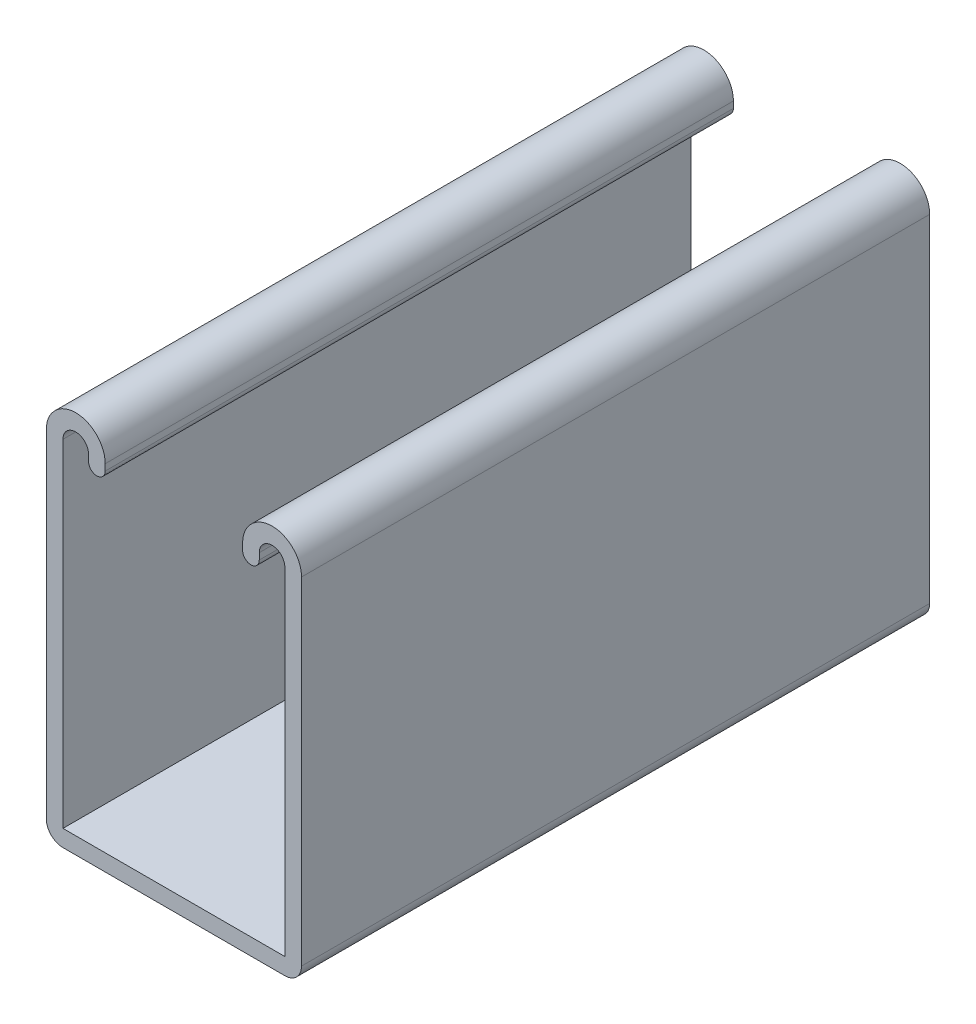
ISO-10303-21;
HEADER;
FILE_DESCRIPTION(('STEP AP214'),'2;1');
FILE_NAME('part.step','',(''),(''),'','','');
FILE_SCHEMA(('AUTOMOTIVE_DESIGN { 1 0 10303 214 1 1 1 1 }'));
ENDSEC;
DATA;
#1=APPLICATION_CONTEXT('core data for automotive mechanical design processes');
#2=APPLICATION_PROTOCOL_DEFINITION('international standard','automotive_design',2000,#1);
#3=PRODUCT_CONTEXT('',#1,'mechanical');
#4=PRODUCT('Part','Part','',(#3));
#5=PRODUCT_RELATED_PRODUCT_CATEGORY('part','',(#4));
#6=PRODUCT_DEFINITION_FORMATION('','',#4);
#7=PRODUCT_DEFINITION_CONTEXT('part definition',#1,'design');
#8=PRODUCT_DEFINITION('design','',#6,#7);
#9=PRODUCT_DEFINITION_SHAPE('','',#8);
#10=(LENGTH_UNIT() NAMED_UNIT(*) SI_UNIT(.MILLI.,.METRE.));
#11=(NAMED_UNIT(*) PLANE_ANGLE_UNIT() SI_UNIT($,.RADIAN.));
#12=(NAMED_UNIT(*) SI_UNIT($,.STERADIAN.) SOLID_ANGLE_UNIT());
#13=UNCERTAINTY_MEASURE_WITH_UNIT(LENGTH_MEASURE(1.E-05),#10,'distance_accuracy_value','');
#14=(GEOMETRIC_REPRESENTATION_CONTEXT(3) GLOBAL_UNCERTAINTY_ASSIGNED_CONTEXT((#13)) GLOBAL_UNIT_ASSIGNED_CONTEXT((#10,
#11,#12)) REPRESENTATION_CONTEXT('',''));
#15=CARTESIAN_POINT('',(0.,0.,0.));
#16=DIRECTION('',(0.,0.,1.));
#17=DIRECTION('',(1.,0.,0.));
#18=AXIS2_PLACEMENT_3D('',#15,#16,#17);
#19=CARTESIAN_POINT('',(-15.875,29.1719,101.6));
#20=DIRECTION('',(0.,0.,-1.));
#21=DIRECTION('',(-1.,0.,0.));
#22=AXIS2_PLACEMENT_3D('',#19,#20,#21);
#23=CYLINDRICAL_SURFACE('',#22,4.7625);
#24=CARTESIAN_POINT('',(-15.875,29.1719,0.));
#25=DIRECTION('',(0.,0.,1.));
#26=DIRECTION('',(-1.,0.,0.));
#27=AXIS2_PLACEMENT_3D('',#24,#25,#26);
#28=CIRCLE('',#27,4.7625);
#29=CARTESIAN_POINT('',(-11.1125,29.1719,0.));
#30=VERTEX_POINT('',#29);
#31=CARTESIAN_POINT('',(-20.6375,29.1719,0.));
#32=VERTEX_POINT('',#31);
#33=EDGE_CURVE('E189',#30,#32,#28,.T.);
#34=ORIENTED_EDGE('',*,*,#33,.T.);
#35=DIRECTION('',(0.,0.,-1.));
#36=VECTOR('',#35,1.);
#37=CARTESIAN_POINT('',(-20.6375,29.1719,101.6));
#38=LINE('',#37,#36);
#39=CARTESIAN_POINT('',(-20.6375,29.1719,101.6));
#40=VERTEX_POINT('',#39);
#41=EDGE_CURVE('E11',#40,#32,#38,.T.);
#42=ORIENTED_EDGE('',*,*,#41,.F.);
#43=CARTESIAN_POINT('',(-15.875,29.1719,101.6));
#44=DIRECTION('',(0.,0.,1.));
#45=DIRECTION('',(-1.,0.,0.));
#46=AXIS2_PLACEMENT_3D('',#43,#44,#45);
#47=CIRCLE('',#46,4.7625);
#48=CARTESIAN_POINT('',(-11.1125,29.1719,101.6));
#49=VERTEX_POINT('',#48);
#50=EDGE_CURVE('E223',#49,#40,#47,.T.);
#51=ORIENTED_EDGE('',*,*,#50,.F.);
#52=DIRECTION('',(0.,0.,-1.));
#53=VECTOR('',#52,1.);
#54=CARTESIAN_POINT('',(-11.1125,29.1719,101.6));
#55=LINE('',#54,#53);
#56=EDGE_CURVE('E185',#49,#30,#55,.T.);
#57=ORIENTED_EDGE('',*,*,#56,.T.);
#58=EDGE_LOOP('',(#34,#42,#51,#57));
#59=FACE_BOUND('',#58,.T.);
#60=ADVANCED_FACE('F32',(#59),#23,.T.);
#61=CARTESIAN_POINT('',(-20.6375,29.1719,101.6));
#62=DIRECTION('',(1.,0.,0.));
#63=DIRECTION('',(0.,1.,0.));
#64=AXIS2_PLACEMENT_3D('',#61,#62,#63);
#65=PLANE('',#64);
#66=DIRECTION('',(0.,-1.,0.));
#67=VECTOR('',#66,1.);
#68=CARTESIAN_POINT('',(-20.6375,29.1719,0.));
#69=LINE('',#68,#67);
#70=CARTESIAN_POINT('',(-20.6375,-25.3238,0.));
#71=VERTEX_POINT('',#70);
#72=EDGE_CURVE('E192',#32,#71,#69,.T.);
#73=ORIENTED_EDGE('',*,*,#72,.T.);
#74=DIRECTION('',(0.,0.,-1.));
#75=VECTOR('',#74,1.);
#76=CARTESIAN_POINT('',(-20.6375,-25.3238,101.6));
#77=LINE('',#76,#75);
#78=CARTESIAN_POINT('',(-20.6375,-25.3238,101.6));
#79=VERTEX_POINT('',#78);
#80=EDGE_CURVE('E41',#79,#71,#77,.T.);
#81=ORIENTED_EDGE('',*,*,#80,.F.);
#82=DIRECTION('',(0.,-1.,0.));
#83=VECTOR('',#82,1.);
#84=CARTESIAN_POINT('',(-20.6375,29.1719,101.6));
#85=LINE('',#84,#83);
#86=EDGE_CURVE('E122',#40,#79,#85,.T.);
#87=ORIENTED_EDGE('',*,*,#86,.F.);
#88=ORIENTED_EDGE('',*,*,#41,.T.);
#89=EDGE_LOOP('',(#73,#81,#87,#88));
#90=FACE_BOUND('',#89,.T.);
#91=ADVANCED_FACE('F332',(#90),#65,.F.);
#92=CARTESIAN_POINT('',(-17.9451,-25.3238,101.6));
#93=DIRECTION('',(0.,0.,-1.));
#94=DIRECTION('',(-1.,0.,0.));
#95=AXIS2_PLACEMENT_3D('',#92,#93,#94);
#96=CYLINDRICAL_SURFACE('',#95,2.6924);
#97=CARTESIAN_POINT('',(-17.9451,-25.3238,0.));
#98=DIRECTION('',(0.,0.,1.));
#99=DIRECTION('',(-1.,0.,0.));
#100=AXIS2_PLACEMENT_3D('',#97,#98,#99);
#101=CIRCLE('',#100,2.6924);
#102=CARTESIAN_POINT('',(-17.9451,-28.0162,0.));
#103=VERTEX_POINT('',#102);
#104=EDGE_CURVE('E194',#71,#103,#101,.T.);
#105=ORIENTED_EDGE('',*,*,#104,.T.);
#106=DIRECTION('',(0.,0.,-1.));
#107=VECTOR('',#106,1.);
#108=CARTESIAN_POINT('',(-17.9451,-28.0162,101.6));
#109=LINE('',#108,#107);
#110=CARTESIAN_POINT('',(-17.9451,-28.0162,101.6));
#111=VERTEX_POINT('',#110);
#112=EDGE_CURVE('E260',#111,#103,#109,.T.);
#113=ORIENTED_EDGE('',*,*,#112,.F.);
#114=CARTESIAN_POINT('',(-17.9451,-25.3238,101.6));
#115=DIRECTION('',(0.,0.,1.));
#116=DIRECTION('',(-1.,0.,0.));
#117=AXIS2_PLACEMENT_3D('',#114,#115,#116);
#118=CIRCLE('',#117,2.6924);
#119=EDGE_CURVE('E269',#79,#111,#118,.T.);
#120=ORIENTED_EDGE('',*,*,#119,.F.);
#121=ORIENTED_EDGE('',*,*,#80,.T.);
#122=EDGE_LOOP('',(#105,#113,#120,#121));
#123=FACE_BOUND('',#122,.T.);
#124=ADVANCED_FACE('F267',(#123),#96,.T.);
#125=CARTESIAN_POINT('',(-17.9451,-28.0162,101.6));
#126=DIRECTION('',(0.,1.,0.));
#127=DIRECTION('',(-1.,0.,0.));
#128=AXIS2_PLACEMENT_3D('',#125,#126,#127);
#129=PLANE('',#128);
#130=CARTESIAN_POINT('',(0.,-28.0162,71.4375));
#131=DIRECTION('',(0.,-1.,0.));
#132=DIRECTION('',(1.,0.,0.));
#133=AXIS2_PLACEMENT_3D('',#130,#131,#132);
#134=CIRCLE('',#133,7.14375);
#135=CARTESIAN_POINT('',(7.14375,-28.0162,71.4375));
#136=VERTEX_POINT('',#135);
#137=EDGE_CURVE('E451',#136,#136,#134,.T.);
#138=ORIENTED_EDGE('',*,*,#137,.F.);
#139=EDGE_LOOP('',(#138));
#140=FACE_BOUND('',#139,.T.);
#141=CARTESIAN_POINT('',(0.,-28.0162,23.8125));
#142=DIRECTION('',(0.,-1.,0.));
#143=DIRECTION('',(1.,0.,0.));
#144=AXIS2_PLACEMENT_3D('',#141,#142,#143);
#145=CIRCLE('',#144,7.14375);
#146=CARTESIAN_POINT('',(7.14375,-28.0162,23.8125));
#147=VERTEX_POINT('',#146);
#148=EDGE_CURVE('E455',#147,#147,#145,.T.);
#149=ORIENTED_EDGE('',*,*,#148,.F.);
#150=EDGE_LOOP('',(#149));
#151=FACE_BOUND('',#150,.T.);
#152=DIRECTION('',(1.,0.,0.));
#153=VECTOR('',#152,1.);
#154=CARTESIAN_POINT('',(-17.9451,-28.0162,0.));
#155=LINE('',#154,#153);
#156=CARTESIAN_POINT('',(17.9451,-28.0162,0.));
#157=VERTEX_POINT('',#156);
#158=EDGE_CURVE('E196',#103,#157,#155,.T.);
#159=ORIENTED_EDGE('',*,*,#158,.T.);
#160=DIRECTION('',(0.,0.,-1.));
#161=VECTOR('',#160,1.);
#162=CARTESIAN_POINT('',(17.9451,-28.0162,101.6));
#163=LINE('',#162,#161);
#164=CARTESIAN_POINT('',(17.9451,-28.0162,101.6));
#165=VERTEX_POINT('',#164);
#166=EDGE_CURVE('E257',#165,#157,#163,.T.);
#167=ORIENTED_EDGE('',*,*,#166,.F.);
#168=DIRECTION('',(1.,0.,0.));
#169=VECTOR('',#168,1.);
#170=CARTESIAN_POINT('',(-17.9451,-28.0162,101.6));
#171=LINE('',#170,#169);
#172=EDGE_CURVE('E287',#111,#165,#171,.T.);
#173=ORIENTED_EDGE('',*,*,#172,.F.);
#174=ORIENTED_EDGE('',*,*,#112,.T.);
#175=EDGE_LOOP('',(#159,#167,#173,#174));
#176=FACE_BOUND('',#175,.T.);
#177=ADVANCED_FACE('F278',(#140,#151,#176),#129,.F.);
#178=CARTESIAN_POINT('',(17.9451,-25.3238,101.6));
#179=DIRECTION('',(0.,0.,-1.));
#180=DIRECTION('',(-1.,0.,0.));
#181=AXIS2_PLACEMENT_3D('',#178,#179,#180);
#182=CYLINDRICAL_SURFACE('',#181,2.6924);
#183=CARTESIAN_POINT('',(17.9451,-25.3238,0.));
#184=DIRECTION('',(0.,0.,1.));
#185=DIRECTION('',(1.,0.,0.));
#186=AXIS2_PLACEMENT_3D('',#183,#184,#185);
#187=CIRCLE('',#186,2.6924);
#188=CARTESIAN_POINT('',(20.6375,-25.3238,0.));
#189=VERTEX_POINT('',#188);
#190=EDGE_CURVE('E198',#157,#189,#187,.T.);
#191=ORIENTED_EDGE('',*,*,#190,.T.);
#192=DIRECTION('',(0.,0.,-1.));
#193=VECTOR('',#192,1.);
#194=CARTESIAN_POINT('',(20.6375,-25.3238,101.6));
#195=LINE('',#194,#193);
#196=CARTESIAN_POINT('',(20.6375,-25.3238,101.6));
#197=VERTEX_POINT('',#196);
#198=EDGE_CURVE('E254',#197,#189,#195,.T.);
#199=ORIENTED_EDGE('',*,*,#198,.F.);
#200=CARTESIAN_POINT('',(17.9451,-25.3238,101.6));
#201=DIRECTION('',(0.,0.,1.));
#202=DIRECTION('',(1.,0.,0.));
#203=AXIS2_PLACEMENT_3D('',#200,#201,#202);
#204=CIRCLE('',#203,2.6924);
#205=EDGE_CURVE('E284',#165,#197,#204,.T.);
#206=ORIENTED_EDGE('',*,*,#205,.F.);
#207=ORIENTED_EDGE('',*,*,#166,.T.);
#208=EDGE_LOOP('',(#191,#199,#206,#207));
#209=FACE_BOUND('',#208,.T.);
#210=ADVANCED_FACE('F282',(#209),#182,.T.);
#211=CARTESIAN_POINT('',(20.6375,-25.3238,101.6));
#212=DIRECTION('',(-1.,0.,0.));
#213=DIRECTION('',(0.,-1.,0.));
#214=AXIS2_PLACEMENT_3D('',#211,#212,#213);
#215=PLANE('',#214);
#216=DIRECTION('',(0.,1.,0.));
#217=VECTOR('',#216,1.);
#218=CARTESIAN_POINT('',(20.6375,-25.3238,0.));
#219=LINE('',#218,#217);
#220=CARTESIAN_POINT('',(20.6375,29.1719,0.));
#221=VERTEX_POINT('',#220);
#222=EDGE_CURVE('E200',#189,#221,#219,.T.);
#223=ORIENTED_EDGE('',*,*,#222,.T.);
#224=DIRECTION('',(0.,0.,-1.));
#225=VECTOR('',#224,1.);
#226=CARTESIAN_POINT('',(20.6375,29.1719,101.6));
#227=LINE('',#226,#225);
#228=CARTESIAN_POINT('',(20.6375,29.1719,101.6));
#229=VERTEX_POINT('',#228);
#230=EDGE_CURVE('E251',#229,#221,#227,.T.);
#231=ORIENTED_EDGE('',*,*,#230,.F.);
#232=DIRECTION('',(0.,1.,0.));
#233=VECTOR('',#232,1.);
#234=CARTESIAN_POINT('',(20.6375,-25.3238,101.6));
#235=LINE('',#234,#233);
#236=EDGE_CURVE('E286',#197,#229,#235,.T.);
#237=ORIENTED_EDGE('',*,*,#236,.F.);
#238=ORIENTED_EDGE('',*,*,#198,.T.);
#239=EDGE_LOOP('',(#223,#231,#237,#238));
#240=FACE_BOUND('',#239,.T.);
#241=ADVANCED_FACE('F346',(#240),#215,.F.);
#242=CARTESIAN_POINT('',(15.875,29.1719,101.6));
#243=DIRECTION('',(0.,0.,-1.));
#244=DIRECTION('',(-1.,0.,0.));
#245=AXIS2_PLACEMENT_3D('',#242,#243,#244);
#246=CYLINDRICAL_SURFACE('',#245,4.7625);
#247=CARTESIAN_POINT('',(15.875,29.1719,0.));
#248=DIRECTION('',(0.,0.,1.));
#249=DIRECTION('',(1.,0.,0.));
#250=AXIS2_PLACEMENT_3D('',#247,#248,#249);
#251=CIRCLE('',#250,4.7625);
#252=CARTESIAN_POINT('',(11.1125,29.1719,0.));
#253=VERTEX_POINT('',#252);
#254=EDGE_CURVE('E202',#221,#253,#251,.T.);
#255=ORIENTED_EDGE('',*,*,#254,.T.);
#256=DIRECTION('',(0.,0.,-1.));
#257=VECTOR('',#256,1.);
#258=CARTESIAN_POINT('',(11.1125,29.1719,101.6));
#259=LINE('',#258,#257);
#260=CARTESIAN_POINT('',(11.1125,29.1719,101.6));
#261=VERTEX_POINT('',#260);
#262=EDGE_CURVE('E248',#261,#253,#259,.T.);
#263=ORIENTED_EDGE('',*,*,#262,.F.);
#264=CARTESIAN_POINT('',(15.875,29.1719,101.6));
#265=DIRECTION('',(0.,0.,1.));
#266=DIRECTION('',(1.,0.,0.));
#267=AXIS2_PLACEMENT_3D('',#264,#265,#266);
#268=CIRCLE('',#267,4.7625);
#269=EDGE_CURVE('E289',#229,#261,#268,.T.);
#270=ORIENTED_EDGE('',*,*,#269,.F.);
#271=ORIENTED_EDGE('',*,*,#230,.T.);
#272=EDGE_LOOP('',(#255,#263,#270,#271));
#273=FACE_BOUND('',#272,.T.);
#274=ADVANCED_FACE('F349',(#273),#246,.T.);
#275=CARTESIAN_POINT('',(11.1125,29.1719,101.6));
#276=DIRECTION('',(1.,0.,0.));
#277=DIRECTION('',(0.,1.,0.));
#278=AXIS2_PLACEMENT_3D('',#275,#276,#277);
#279=PLANE('',#278);
#280=DIRECTION('',(0.,-1.,0.));
#281=VECTOR('',#280,1.);
#282=CARTESIAN_POINT('',(11.1125,29.1719,0.));
#283=LINE('',#282,#281);
#284=CARTESIAN_POINT('',(11.1125,28.13685,0.));
#285=VERTEX_POINT('',#284);
#286=EDGE_CURVE('E204',#253,#285,#283,.T.);
#287=ORIENTED_EDGE('',*,*,#286,.T.);
#288=DIRECTION('',(0.,0.,-1.));
#289=VECTOR('',#288,1.);
#290=CARTESIAN_POINT('',(11.1125,28.13685,101.6));
#291=LINE('',#290,#289);
#292=CARTESIAN_POINT('',(11.1125,28.13685,101.6));
#293=VERTEX_POINT('',#292);
#294=EDGE_CURVE('E245',#293,#285,#291,.T.);
#295=ORIENTED_EDGE('',*,*,#294,.F.);
#296=DIRECTION('',(0.,-1.,0.));
#297=VECTOR('',#296,1.);
#298=CARTESIAN_POINT('',(11.1125,29.1719,101.6));
#299=LINE('',#298,#297);
#300=EDGE_CURVE('E295',#261,#293,#299,.T.);
#301=ORIENTED_EDGE('',*,*,#300,.F.);
#302=ORIENTED_EDGE('',*,*,#262,.T.);
#303=EDGE_LOOP('',(#287,#295,#301,#302));
#304=FACE_BOUND('',#303,.T.);
#305=ADVANCED_FACE('F353',(#304),#279,.F.);
#306=CARTESIAN_POINT('',(12.4587,28.13685,101.6));
#307=DIRECTION('',(0.,0.,-1.));
#308=DIRECTION('',(-1.,0.,0.));
#309=AXIS2_PLACEMENT_3D('',#306,#307,#308);
#310=CYLINDRICAL_SURFACE('',#309,1.3462);
#311=CARTESIAN_POINT('',(12.4587,28.13685,0.));
#312=DIRECTION('',(0.,0.,1.));
#313=DIRECTION('',(1.,0.,0.));
#314=AXIS2_PLACEMENT_3D('',#311,#312,#313);
#315=CIRCLE('',#314,1.3462);
#316=CARTESIAN_POINT('',(13.8049,28.13685,0.));
#317=VERTEX_POINT('',#316);
#318=EDGE_CURVE('E206',#285,#317,#315,.T.);
#319=ORIENTED_EDGE('',*,*,#318,.T.);
#320=DIRECTION('',(0.,0.,-1.));
#321=VECTOR('',#320,1.);
#322=CARTESIAN_POINT('',(13.8049,28.13685,101.6));
#323=LINE('',#322,#321);
#324=CARTESIAN_POINT('',(13.8049,28.13685,101.6));
#325=VERTEX_POINT('',#324);
#326=EDGE_CURVE('E242',#325,#317,#323,.T.);
#327=ORIENTED_EDGE('',*,*,#326,.F.);
#328=CARTESIAN_POINT('',(12.4587,28.13685,101.6));
#329=DIRECTION('',(0.,0.,1.));
#330=DIRECTION('',(1.,0.,0.));
#331=AXIS2_PLACEMENT_3D('',#328,#329,#330);
#332=CIRCLE('',#331,1.3462);
#333=EDGE_CURVE('E297',#293,#325,#332,.T.);
#334=ORIENTED_EDGE('',*,*,#333,.F.);
#335=ORIENTED_EDGE('',*,*,#294,.T.);
#336=EDGE_LOOP('',(#319,#327,#334,#335));
#337=FACE_BOUND('',#336,.T.);
#338=ADVANCED_FACE('F357',(#337),#310,.T.);
#339=CARTESIAN_POINT('',(13.8049,29.1719,101.6));
#340=DIRECTION('',(-1.,0.,0.));
#341=DIRECTION('',(0.,0.,1.));
#342=AXIS2_PLACEMENT_3D('',#339,#340,#341);
#343=PLANE('',#342);
#344=DIRECTION('',(0.,1.,0.));
#345=VECTOR('',#344,1.);
#346=CARTESIAN_POINT('',(13.8049,29.1719,0.));
#347=LINE('',#346,#345);
#348=CARTESIAN_POINT('',(13.8049,29.1719,0.));
#349=VERTEX_POINT('',#348);
#350=EDGE_CURVE('E208',#317,#349,#347,.T.);
#351=ORIENTED_EDGE('',*,*,#350,.T.);
#352=DIRECTION('',(0.,0.,-1.));
#353=VECTOR('',#352,1.);
#354=CARTESIAN_POINT('',(13.8049,29.1719,101.6));
#355=LINE('',#354,#353);
#356=CARTESIAN_POINT('',(13.8049,29.1719,101.6));
#357=VERTEX_POINT('',#356);
#358=EDGE_CURVE('E239',#357,#349,#355,.T.);
#359=ORIENTED_EDGE('',*,*,#358,.F.);
#360=DIRECTION('',(0.,1.,0.));
#361=VECTOR('',#360,1.);
#362=CARTESIAN_POINT('',(13.8049,29.1719,101.6));
#363=LINE('',#362,#361);
#364=EDGE_CURVE('E299',#325,#357,#363,.T.);
#365=ORIENTED_EDGE('',*,*,#364,.F.);
#366=ORIENTED_EDGE('',*,*,#326,.T.);
#367=EDGE_LOOP('',(#351,#359,#365,#366));
#368=FACE_BOUND('',#367,.T.);
#369=ADVANCED_FACE('F361',(#368),#343,.F.);
#370=CARTESIAN_POINT('',(15.875,29.1719,101.6));
#371=DIRECTION('',(0.,0.,-1.));
#372=DIRECTION('',(-1.,0.,0.));
#373=AXIS2_PLACEMENT_3D('',#370,#371,#372);
#374=CYLINDRICAL_SURFACE('',#373,2.0701);
#375=CARTESIAN_POINT('',(15.875,29.1719,0.));
#376=DIRECTION('',(0.,0.,-1.));
#377=DIRECTION('',(1.,0.,0.));
#378=AXIS2_PLACEMENT_3D('',#375,#376,#377);
#379=CIRCLE('',#378,2.0701);
#380=CARTESIAN_POINT('',(17.9451,29.1719,0.));
#381=VERTEX_POINT('',#380);
#382=EDGE_CURVE('E210',#349,#381,#379,.T.);
#383=ORIENTED_EDGE('',*,*,#382,.T.);
#384=DIRECTION('',(0.,0.,-1.));
#385=VECTOR('',#384,1.);
#386=CARTESIAN_POINT('',(17.9451,29.1719,101.6));
#387=LINE('',#386,#385);
#388=CARTESIAN_POINT('',(17.9451,29.1719,101.6));
#389=VERTEX_POINT('',#388);
#390=EDGE_CURVE('E236',#389,#381,#387,.T.);
#391=ORIENTED_EDGE('',*,*,#390,.F.);
#392=CARTESIAN_POINT('',(15.875,29.1719,101.6));
#393=DIRECTION('',(0.,0.,-1.));
#394=DIRECTION('',(1.,0.,0.));
#395=AXIS2_PLACEMENT_3D('',#392,#393,#394);
#396=CIRCLE('',#395,2.0701);
#397=EDGE_CURVE('E301',#357,#389,#396,.T.);
#398=ORIENTED_EDGE('',*,*,#397,.F.);
#399=ORIENTED_EDGE('',*,*,#358,.T.);
#400=EDGE_LOOP('',(#383,#391,#398,#399));
#401=FACE_BOUND('',#400,.T.);
#402=ADVANCED_FACE('F365',(#401),#374,.F.);
#403=CARTESIAN_POINT('',(17.9451,-25.3238,101.6));
#404=DIRECTION('',(1.,0.,0.));
#405=DIRECTION('',(0.,0.,-1.));
#406=AXIS2_PLACEMENT_3D('',#403,#404,#405);
#407=PLANE('',#406);
#408=DIRECTION('',(0.,-1.,0.));
#409=VECTOR('',#408,1.);
#410=CARTESIAN_POINT('',(17.9451,-25.3238,0.));
#411=LINE('',#410,#409);
#412=CARTESIAN_POINT('',(17.9451,-25.3238,0.));
#413=VERTEX_POINT('',#412);
#414=EDGE_CURVE('E212',#381,#413,#411,.T.);
#415=ORIENTED_EDGE('',*,*,#414,.T.);
#416=DIRECTION('',(0.,0.,-1.));
#417=VECTOR('',#416,1.);
#418=CARTESIAN_POINT('',(17.9451,-25.3238,101.6));
#419=LINE('',#418,#417);
#420=CARTESIAN_POINT('',(17.9451,-25.3238,101.6));
#421=VERTEX_POINT('',#420);
#422=EDGE_CURVE('E233',#421,#413,#419,.T.);
#423=ORIENTED_EDGE('',*,*,#422,.F.);
#424=DIRECTION('',(0.,-1.,0.));
#425=VECTOR('',#424,1.);
#426=CARTESIAN_POINT('',(17.9451,-25.3238,101.6));
#427=LINE('',#426,#425);
#428=EDGE_CURVE('E303',#389,#421,#427,.T.);
#429=ORIENTED_EDGE('',*,*,#428,.F.);
#430=ORIENTED_EDGE('',*,*,#390,.T.);
#431=EDGE_LOOP('',(#415,#423,#429,#430));
#432=FACE_BOUND('',#431,.T.);
#433=ADVANCED_FACE('F369',(#432),#407,.F.);
#434=CARTESIAN_POINT('',(-17.9451,-25.3238,101.6));
#435=DIRECTION('',(0.,-1.,0.));
#436=DIRECTION('',(0.,0.,-1.));
#437=AXIS2_PLACEMENT_3D('',#434,#435,#436);
#438=PLANE('',#437);
#439=CARTESIAN_POINT('',(0.,-25.3238,71.4375));
#440=DIRECTION('',(0.,-1.,0.));
#441=DIRECTION('',(0.,0.,-1.));
#442=AXIS2_PLACEMENT_3D('',#439,#440,#441);
#443=CIRCLE('',#442,7.14375);
#444=CARTESIAN_POINT('',(7.14375,-25.3238,71.4375));
#445=VERTEX_POINT('',#444);
#446=EDGE_CURVE('E454',#445,#445,#443,.T.);
#447=ORIENTED_EDGE('',*,*,#446,.T.);
#448=EDGE_LOOP('',(#447));
#449=FACE_BOUND('',#448,.T.);
#450=CARTESIAN_POINT('',(0.,-25.3238,23.8125));
#451=DIRECTION('',(0.,-1.,0.));
#452=DIRECTION('',(0.,0.,-1.));
#453=AXIS2_PLACEMENT_3D('',#450,#451,#452);
#454=CIRCLE('',#453,7.14375);
#455=CARTESIAN_POINT('',(7.14375,-25.3238,23.8125));
#456=VERTEX_POINT('',#455);
#457=EDGE_CURVE('E35',#456,#456,#454,.T.);
#458=ORIENTED_EDGE('',*,*,#457,.T.);
#459=EDGE_LOOP('',(#458));
#460=FACE_BOUND('',#459,.T.);
#461=DIRECTION('',(-1.,0.,0.));
#462=VECTOR('',#461,1.);
#463=CARTESIAN_POINT('',(-17.9451,-25.3238,0.));
#464=LINE('',#463,#462);
#465=CARTESIAN_POINT('',(-17.9451,-25.3238,0.));
#466=VERTEX_POINT('',#465);
#467=EDGE_CURVE('E214',#413,#466,#464,.T.);
#468=ORIENTED_EDGE('',*,*,#467,.T.);
#469=DIRECTION('',(0.,0.,-1.));
#470=VECTOR('',#469,1.);
#471=CARTESIAN_POINT('',(-17.9451,-25.3238,101.6));
#472=LINE('',#471,#470);
#473=CARTESIAN_POINT('',(-17.9451,-25.3238,101.6));
#474=VERTEX_POINT('',#473);
#475=EDGE_CURVE('E230',#474,#466,#472,.T.);
#476=ORIENTED_EDGE('',*,*,#475,.F.);
#477=DIRECTION('',(-1.,0.,0.));
#478=VECTOR('',#477,1.);
#479=CARTESIAN_POINT('',(-17.9451,-25.3238,101.6));
#480=LINE('',#479,#478);
#481=EDGE_CURVE('E305',#421,#474,#480,.T.);
#482=ORIENTED_EDGE('',*,*,#481,.F.);
#483=ORIENTED_EDGE('',*,*,#422,.T.);
#484=EDGE_LOOP('',(#468,#476,#482,#483));
#485=FACE_BOUND('',#484,.T.);
#486=ADVANCED_FACE('F373',(#449,#460,#485),#438,.F.);
#487=CARTESIAN_POINT('',(-17.9451,29.1719,101.6));
#488=DIRECTION('',(-1.,0.,0.));
#489=DIRECTION('',(0.,-1.,0.));
#490=AXIS2_PLACEMENT_3D('',#487,#488,#489);
#491=PLANE('',#490);
#492=DIRECTION('',(0.,1.,0.));
#493=VECTOR('',#492,1.);
#494=CARTESIAN_POINT('',(-17.9451,29.1719,0.));
#495=LINE('',#494,#493);
#496=CARTESIAN_POINT('',(-17.9451,29.1719,0.));
#497=VERTEX_POINT('',#496);
#498=EDGE_CURVE('E216',#466,#497,#495,.T.);
#499=ORIENTED_EDGE('',*,*,#498,.T.);
#500=DIRECTION('',(0.,0.,-1.));
#501=VECTOR('',#500,1.);
#502=CARTESIAN_POINT('',(-17.9451,29.1719,101.6));
#503=LINE('',#502,#501);
#504=CARTESIAN_POINT('',(-17.9451,29.1719,101.6));
#505=VERTEX_POINT('',#504);
#506=EDGE_CURVE('E227',#505,#497,#503,.T.);
#507=ORIENTED_EDGE('',*,*,#506,.F.);
#508=DIRECTION('',(0.,1.,0.));
#509=VECTOR('',#508,1.);
#510=CARTESIAN_POINT('',(-17.9451,29.1719,101.6));
#511=LINE('',#510,#509);
#512=EDGE_CURVE('E307',#474,#505,#511,.T.);
#513=ORIENTED_EDGE('',*,*,#512,.F.);
#514=ORIENTED_EDGE('',*,*,#475,.T.);
#515=EDGE_LOOP('',(#499,#507,#513,#514));
#516=FACE_BOUND('',#515,.T.);
#517=ADVANCED_FACE('F313',(#516),#491,.F.);
#518=CARTESIAN_POINT('',(-15.875,29.1719,101.6));
#519=DIRECTION('',(0.,0.,-1.));
#520=DIRECTION('',(-1.,0.,0.));
#521=AXIS2_PLACEMENT_3D('',#518,#519,#520);
#522=CYLINDRICAL_SURFACE('',#521,2.0701);
#523=CARTESIAN_POINT('',(-15.875,29.1719,0.));
#524=DIRECTION('',(0.,0.,-1.));
#525=DIRECTION('',(-1.,0.,0.));
#526=AXIS2_PLACEMENT_3D('',#523,#524,#525);
#527=CIRCLE('',#526,2.0701);
#528=CARTESIAN_POINT('',(-13.8049,29.1719,0.));
#529=VERTEX_POINT('',#528);
#530=EDGE_CURVE('E218',#497,#529,#527,.T.);
#531=ORIENTED_EDGE('',*,*,#530,.T.);
#532=DIRECTION('',(0.,0.,-1.));
#533=VECTOR('',#532,1.);
#534=CARTESIAN_POINT('',(-13.8049,29.1719,101.6));
#535=LINE('',#534,#533);
#536=CARTESIAN_POINT('',(-13.8049,29.1719,101.6));
#537=VERTEX_POINT('',#536);
#538=EDGE_CURVE('E180',#537,#529,#535,.T.);
#539=ORIENTED_EDGE('',*,*,#538,.F.);
#540=CARTESIAN_POINT('',(-15.875,29.1719,101.6));
#541=DIRECTION('',(0.,0.,-1.));
#542=DIRECTION('',(-1.,0.,0.));
#543=AXIS2_PLACEMENT_3D('',#540,#541,#542);
#544=CIRCLE('',#543,2.0701);
#545=EDGE_CURVE('E171',#505,#537,#544,.T.);
#546=ORIENTED_EDGE('',*,*,#545,.F.);
#547=ORIENTED_EDGE('',*,*,#506,.T.);
#548=EDGE_LOOP('',(#531,#539,#546,#547));
#549=FACE_BOUND('',#548,.T.);
#550=ADVANCED_FACE('F317',(#549),#522,.F.);
#551=CARTESIAN_POINT('',(-13.8049,29.1719,101.6));
#552=DIRECTION('',(1.,0.,0.));
#553=DIRECTION('',(0.,0.,-1.));
#554=AXIS2_PLACEMENT_3D('',#551,#552,#553);
#555=PLANE('',#554);
#556=DIRECTION('',(0.,-1.,0.));
#557=VECTOR('',#556,1.);
#558=CARTESIAN_POINT('',(-13.8049,29.1719,0.));
#559=LINE('',#558,#557);
#560=CARTESIAN_POINT('',(-13.8049,28.13685,0.));
#561=VERTEX_POINT('',#560);
#562=EDGE_CURVE('E179',#529,#561,#559,.T.);
#563=ORIENTED_EDGE('',*,*,#562,.T.);
#564=DIRECTION('',(0.,0.,-1.));
#565=VECTOR('',#564,1.);
#566=CARTESIAN_POINT('',(-13.8049,28.13685,101.6));
#567=LINE('',#566,#565);
#568=CARTESIAN_POINT('',(-13.8049,28.13685,101.6));
#569=VERTEX_POINT('',#568);
#570=EDGE_CURVE('E176',#569,#561,#567,.T.);
#571=ORIENTED_EDGE('',*,*,#570,.F.);
#572=DIRECTION('',(0.,-1.,0.));
#573=VECTOR('',#572,1.);
#574=CARTESIAN_POINT('',(-13.8049,29.1719,101.6));
#575=LINE('',#574,#573);
#576=EDGE_CURVE('E165',#537,#569,#575,.T.);
#577=ORIENTED_EDGE('',*,*,#576,.F.);
#578=ORIENTED_EDGE('',*,*,#538,.T.);
#579=EDGE_LOOP('',(#563,#571,#577,#578));
#580=FACE_BOUND('',#579,.T.);
#581=ADVANCED_FACE('F177',(#580),#555,.F.);
#582=CARTESIAN_POINT('',(-12.4587,28.13685,101.6));
#583=DIRECTION('',(0.,0.,-1.));
#584=DIRECTION('',(-1.,0.,0.));
#585=AXIS2_PLACEMENT_3D('',#582,#583,#584);
#586=CYLINDRICAL_SURFACE('',#585,1.3462);
#587=CARTESIAN_POINT('',(-12.4587,28.13685,0.));
#588=DIRECTION('',(0.,0.,1.));
#589=DIRECTION('',(-1.,0.,0.));
#590=AXIS2_PLACEMENT_3D('',#587,#588,#589);
#591=CIRCLE('',#590,1.3462);
#592=CARTESIAN_POINT('',(-11.1125,28.13685,0.));
#593=VERTEX_POINT('',#592);
#594=EDGE_CURVE('E108',#561,#593,#591,.T.);
#595=ORIENTED_EDGE('',*,*,#594,.T.);
#596=DIRECTION('',(0.,0.,-1.));
#597=VECTOR('',#596,1.);
#598=CARTESIAN_POINT('',(-11.1125,28.13685,101.6));
#599=LINE('',#598,#597);
#600=CARTESIAN_POINT('',(-11.1125,28.13685,101.6));
#601=VERTEX_POINT('',#600);
#602=EDGE_CURVE('E181',#601,#593,#599,.T.);
#603=ORIENTED_EDGE('',*,*,#602,.F.);
#604=CARTESIAN_POINT('',(-12.4587,28.13685,101.6));
#605=DIRECTION('',(0.,0.,1.));
#606=DIRECTION('',(-1.,0.,0.));
#607=AXIS2_PLACEMENT_3D('',#604,#605,#606);
#608=CIRCLE('',#607,1.3462);
#609=EDGE_CURVE('E169',#569,#601,#608,.T.);
#610=ORIENTED_EDGE('',*,*,#609,.F.);
#611=ORIENTED_EDGE('',*,*,#570,.T.);
#612=EDGE_LOOP('',(#595,#603,#610,#611));
#613=FACE_BOUND('',#612,.T.);
#614=ADVANCED_FACE('F183',(#613),#586,.T.);
#615=CARTESIAN_POINT('',(-11.1125,29.1719,101.6));
#616=DIRECTION('',(-1.,0.,0.));
#617=DIRECTION('',(0.,-1.,0.));
#618=AXIS2_PLACEMENT_3D('',#615,#616,#617);
#619=PLANE('',#618);
#620=DIRECTION('',(0.,1.,0.));
#621=VECTOR('',#620,1.);
#622=CARTESIAN_POINT('',(-11.1125,29.1719,0.));
#623=LINE('',#622,#621);
#624=EDGE_CURVE('E114',#593,#30,#623,.T.);
#625=ORIENTED_EDGE('',*,*,#624,.T.);
#626=ORIENTED_EDGE('',*,*,#56,.F.);
#627=DIRECTION('',(0.,1.,0.));
#628=VECTOR('',#627,1.);
#629=CARTESIAN_POINT('',(-11.1125,29.1719,101.6));
#630=LINE('',#629,#628);
#631=EDGE_CURVE('E49',#601,#49,#630,.T.);
#632=ORIENTED_EDGE('',*,*,#631,.F.);
#633=ORIENTED_EDGE('',*,*,#602,.T.);
#634=EDGE_LOOP('',(#625,#626,#632,#633));
#635=FACE_BOUND('',#634,.T.);
#636=ADVANCED_FACE('F321',(#635),#619,.F.);
#637=CARTESIAN_POINT('',(-15.875,29.1719,101.6));
#638=DIRECTION('',(0.,0.,-1.));
#639=DIRECTION('',(-1.,0.,0.));
#640=AXIS2_PLACEMENT_3D('',#637,#638,#639);
#641=PLANE('',#640);
#642=ORIENTED_EDGE('',*,*,#50,.T.);
#643=ORIENTED_EDGE('',*,*,#86,.T.);
#644=ORIENTED_EDGE('',*,*,#119,.T.);
#645=ORIENTED_EDGE('',*,*,#172,.T.);
#646=ORIENTED_EDGE('',*,*,#205,.T.);
#647=ORIENTED_EDGE('',*,*,#236,.T.);
#648=ORIENTED_EDGE('',*,*,#269,.T.);
#649=ORIENTED_EDGE('',*,*,#300,.T.);
#650=ORIENTED_EDGE('',*,*,#333,.T.);
#651=ORIENTED_EDGE('',*,*,#364,.T.);
#652=ORIENTED_EDGE('',*,*,#397,.T.);
#653=ORIENTED_EDGE('',*,*,#428,.T.);
#654=ORIENTED_EDGE('',*,*,#481,.T.);
#655=ORIENTED_EDGE('',*,*,#512,.T.);
#656=ORIENTED_EDGE('',*,*,#545,.T.);
#657=ORIENTED_EDGE('',*,*,#576,.T.);
#658=ORIENTED_EDGE('',*,*,#609,.T.);
#659=ORIENTED_EDGE('',*,*,#631,.T.);
#660=EDGE_LOOP('',(#642,#643,#644,#645,#646,#647,#648,#649,#650,#651,#652,#653,#654,#655,#656,
#657,#658,#659));
#661=FACE_BOUND('',#660,.T.);
#662=ADVANCED_FACE('F167',(#661),#641,.F.);
#663=CARTESIAN_POINT('',(-15.875,29.1719,0.));
#664=DIRECTION('',(0.,0.,-1.));
#665=DIRECTION('',(-1.,0.,0.));
#666=AXIS2_PLACEMENT_3D('',#663,#664,#665);
#667=PLANE('',#666);
#668=ORIENTED_EDGE('',*,*,#33,.F.);
#669=ORIENTED_EDGE('',*,*,#624,.F.);
#670=ORIENTED_EDGE('',*,*,#594,.F.);
#671=ORIENTED_EDGE('',*,*,#562,.F.);
#672=ORIENTED_EDGE('',*,*,#530,.F.);
#673=ORIENTED_EDGE('',*,*,#498,.F.);
#674=ORIENTED_EDGE('',*,*,#467,.F.);
#675=ORIENTED_EDGE('',*,*,#414,.F.);
#676=ORIENTED_EDGE('',*,*,#382,.F.);
#677=ORIENTED_EDGE('',*,*,#350,.F.);
#678=ORIENTED_EDGE('',*,*,#318,.F.);
#679=ORIENTED_EDGE('',*,*,#286,.F.);
#680=ORIENTED_EDGE('',*,*,#254,.F.);
#681=ORIENTED_EDGE('',*,*,#222,.F.);
#682=ORIENTED_EDGE('',*,*,#190,.F.);
#683=ORIENTED_EDGE('',*,*,#158,.F.);
#684=ORIENTED_EDGE('',*,*,#104,.F.);
#685=ORIENTED_EDGE('',*,*,#72,.F.);
#686=EDGE_LOOP('',(#668,#669,#670,#671,#672,#673,#674,#675,#676,#677,#678,#679,#680,#681,#682,
#683,#684,#685));
#687=FACE_BOUND('',#686,.T.);
#688=ADVANCED_FACE('F273',(#687),#667,.T.);
#689=CARTESIAN_POINT('',(0.,33.9344,23.8125));
#690=DIRECTION('',(0.,-1.,0.));
#691=DIRECTION('',(1.,0.,0.));
#692=AXIS2_PLACEMENT_3D('',#689,#690,#691);
#693=CYLINDRICAL_SURFACE('',#692,7.14375);
#694=CARTESIAN_POINT('',(7.14375,-28.0162,23.8125));
#695=CARTESIAN_POINT('',(7.14375,-27.9881541666667,23.8125));
#696=CARTESIAN_POINT('',(7.14375,-27.9601083333333,23.8125));
#697=CARTESIAN_POINT('',(7.14375,-27.9040166666667,23.8125));
#698=CARTESIAN_POINT('',(7.14375,-27.8759708333333,23.8125));
#699=CARTESIAN_POINT('',(7.14375,-27.8198791666667,23.8125));
#700=CARTESIAN_POINT('',(7.14375,-27.7918333333333,23.8125));
#701=CARTESIAN_POINT('',(7.14375,-27.7357416666667,23.8125));
#702=CARTESIAN_POINT('',(7.14375,-27.7076958333333,23.8125));
#703=CARTESIAN_POINT('',(7.14375,-27.6516041666667,23.8125));
#704=CARTESIAN_POINT('',(7.14375,-27.6235583333333,23.8125));
#705=CARTESIAN_POINT('',(7.14375,-27.5674666666667,23.8125));
#706=CARTESIAN_POINT('',(7.14375,-27.5394208333333,23.8125));
#707=CARTESIAN_POINT('',(7.14375,-27.4833291666667,23.8125));
#708=CARTESIAN_POINT('',(7.14375,-27.4552833333333,23.8125));
#709=CARTESIAN_POINT('',(7.14375,-27.3991916666667,23.8125));
#710=CARTESIAN_POINT('',(7.14375,-27.3711458333333,23.8125));
#711=CARTESIAN_POINT('',(7.14375,-27.3150541666667,23.8125));
#712=CARTESIAN_POINT('',(7.14375,-27.2870083333333,23.8125));
#713=CARTESIAN_POINT('',(7.14375,-27.2309166666667,23.8125));
#714=CARTESIAN_POINT('',(7.14375,-27.2028708333333,23.8125));
#715=CARTESIAN_POINT('',(7.14375,-27.1467791666667,23.8125));
#716=CARTESIAN_POINT('',(7.14375,-27.1187333333333,23.8125));
#717=CARTESIAN_POINT('',(7.14375,-27.0626416666667,23.8125));
#718=CARTESIAN_POINT('',(7.14375,-27.0345958333333,23.8125));
#719=CARTESIAN_POINT('',(7.14375,-26.9785041666667,23.8125));
#720=CARTESIAN_POINT('',(7.14375,-26.9504583333333,23.8125));
#721=CARTESIAN_POINT('',(7.14375,-26.8943666666667,23.8125));
#722=CARTESIAN_POINT('',(7.14375,-26.8663208333333,23.8125));
#723=CARTESIAN_POINT('',(7.14375,-26.8102291666667,23.8125));
#724=CARTESIAN_POINT('',(7.14375,-26.7821833333333,23.8125));
#725=CARTESIAN_POINT('',(7.14375,-26.7260916666667,23.8125));
#726=CARTESIAN_POINT('',(7.14375,-26.6980458333333,23.8125));
#727=CARTESIAN_POINT('',(7.14375,-26.6419541666667,23.8125));
#728=CARTESIAN_POINT('',(7.14375,-26.6139083333333,23.8125));
#729=CARTESIAN_POINT('',(7.14375,-26.5578166666667,23.8125));
#730=CARTESIAN_POINT('',(7.14375,-26.5297708333333,23.8125));
#731=CARTESIAN_POINT('',(7.14375,-26.4736791666667,23.8125));
#732=CARTESIAN_POINT('',(7.14375,-26.4456333333333,23.8125));
#733=CARTESIAN_POINT('',(7.14375,-26.3895416666667,23.8125));
#734=CARTESIAN_POINT('',(7.14375,-26.3614958333333,23.8125));
#735=CARTESIAN_POINT('',(7.14375,-26.3054041666667,23.8125));
#736=CARTESIAN_POINT('',(7.14375,-26.2773583333333,23.8125));
#737=CARTESIAN_POINT('',(7.14375,-26.2212666666667,23.8125));
#738=CARTESIAN_POINT('',(7.14375,-26.1932208333333,23.8125));
#739=CARTESIAN_POINT('',(7.14375,-26.1371291666667,23.8125));
#740=CARTESIAN_POINT('',(7.14375,-26.1090833333333,23.8125));
#741=CARTESIAN_POINT('',(7.14375,-26.0529916666667,23.8125));
#742=CARTESIAN_POINT('',(7.14375,-26.0249458333333,23.8125));
#743=CARTESIAN_POINT('',(7.14375,-25.9688541666667,23.8125));
#744=CARTESIAN_POINT('',(7.14375,-25.9408083333333,23.8125));
#745=CARTESIAN_POINT('',(7.14375,-25.8847166666667,23.8125));
#746=CARTESIAN_POINT('',(7.14375,-25.8566708333333,23.8125));
#747=CARTESIAN_POINT('',(7.14375,-25.8005791666667,23.8125));
#748=CARTESIAN_POINT('',(7.14375,-25.7725333333333,23.8125));
#749=CARTESIAN_POINT('',(7.14375,-25.7164416666667,23.8125));
#750=CARTESIAN_POINT('',(7.14375,-25.6883958333333,23.8125));
#751=CARTESIAN_POINT('',(7.14375,-25.6323041666667,23.8125));
#752=CARTESIAN_POINT('',(7.14375,-25.6042583333333,23.8125));
#753=CARTESIAN_POINT('',(7.14375,-25.5481666666667,23.8125));
#754=CARTESIAN_POINT('',(7.14375,-25.5201208333333,23.8125));
#755=CARTESIAN_POINT('',(7.14375,-25.4640291666667,23.8125));
#756=CARTESIAN_POINT('',(7.14375,-25.4359833333333,23.8125));
#757=CARTESIAN_POINT('',(7.14375,-25.3798916666667,23.8125));
#758=CARTESIAN_POINT('',(7.14375,-25.3518458333333,23.8125));
#759=CARTESIAN_POINT('',(7.14375,-25.3238,23.8125));
#760=B_SPLINE_CURVE_WITH_KNOTS('',3,(#694,#695,#696,#697,#698,#699,#700,#701,#702,#703,#704,
#705,#706,#707,#708,#709,#710,#711,#712,#713,#714,#715,#716,#717,#718,#719,#720,#721,#722,#723,
#724,#725,#726,#727,#728,#729,#730,#731,#732,#733,#734,#735,#736,#737,#738,#739,#740,#741,#742,
#743,#744,#745,#746,#747,#748,#749,#750,#751,#752,#753,#754,#755,#756,#757,#758,#759),
.UNSPECIFIED.,.F.,.F.,(4,2,2,2,2,2,2,2,2,2,2,2,2,2,2,2,2,2,2,2,2,2,2,2,2,2,2,2,2,2,2,2,4),(0.,
0.0841374999999978,0.168275000000002,0.2524125,0.336549999999998,0.420687500000003,0.504825,
0.588962499999998,0.673099999999996,0.757237500000001,0.841374999999998,0.925512499999996,
1.00965,1.0937875,1.177925,1.2620625,1.3462,1.4303375,1.514475,1.5986125,1.68275,1.7668875,
1.851025,1.9351625,2.0193,2.1034375,2.187575,2.2717125,2.35585,2.4399875,2.524125,2.6082625,
2.6924),.UNSPECIFIED.);
#761=EDGE_CURVE('BSEAM410',#147,#456,#760,.T.);
#762=ORIENTED_EDGE('',*,*,#148,.T.);
#763=ORIENTED_EDGE('',*,*,#457,.F.);
#764=ORIENTED_EDGE('',*,*,#761,.T.);
#765=ORIENTED_EDGE('',*,*,#761,.F.);
#766=EDGE_LOOP('',(#762,#764,#763,#765));
#767=FACE_BOUND('',#766,.T.);
#768=ADVANCED_FACE('F410',(#767),#693,.F.);
#769=CARTESIAN_POINT('',(0.,33.9344,71.4375));
#770=DIRECTION('',(0.,-1.,0.));
#771=DIRECTION('',(1.,0.,0.));
#772=AXIS2_PLACEMENT_3D('',#769,#770,#771);
#773=CYLINDRICAL_SURFACE('',#772,7.14375);
#774=CARTESIAN_POINT('',(7.14375,-28.0162,71.4375));
#775=CARTESIAN_POINT('',(7.14375,-27.9881541666667,71.4375));
#776=CARTESIAN_POINT('',(7.14375,-27.9601083333333,71.4375));
#777=CARTESIAN_POINT('',(7.14375,-27.9040166666667,71.4375));
#778=CARTESIAN_POINT('',(7.14375,-27.8759708333333,71.4375));
#779=CARTESIAN_POINT('',(7.14375,-27.8198791666667,71.4375));
#780=CARTESIAN_POINT('',(7.14375,-27.7918333333333,71.4375));
#781=CARTESIAN_POINT('',(7.14375,-27.7357416666667,71.4375));
#782=CARTESIAN_POINT('',(7.14375,-27.7076958333333,71.4375));
#783=CARTESIAN_POINT('',(7.14375,-27.6516041666667,71.4375));
#784=CARTESIAN_POINT('',(7.14375,-27.6235583333333,71.4375));
#785=CARTESIAN_POINT('',(7.14375,-27.5674666666667,71.4375));
#786=CARTESIAN_POINT('',(7.14375,-27.5394208333333,71.4375));
#787=CARTESIAN_POINT('',(7.14375,-27.4833291666667,71.4375));
#788=CARTESIAN_POINT('',(7.14375,-27.4552833333333,71.4375));
#789=CARTESIAN_POINT('',(7.14375,-27.3991916666667,71.4375));
#790=CARTESIAN_POINT('',(7.14375,-27.3711458333333,71.4375));
#791=CARTESIAN_POINT('',(7.14375,-27.3150541666667,71.4375));
#792=CARTESIAN_POINT('',(7.14375,-27.2870083333333,71.4375));
#793=CARTESIAN_POINT('',(7.14375,-27.2309166666667,71.4375));
#794=CARTESIAN_POINT('',(7.14375,-27.2028708333333,71.4375));
#795=CARTESIAN_POINT('',(7.14375,-27.1467791666667,71.4375));
#796=CARTESIAN_POINT('',(7.14375,-27.1187333333333,71.4375));
#797=CARTESIAN_POINT('',(7.14375,-27.0626416666667,71.4375));
#798=CARTESIAN_POINT('',(7.14375,-27.0345958333333,71.4375));
#799=CARTESIAN_POINT('',(7.14375,-26.9785041666667,71.4375));
#800=CARTESIAN_POINT('',(7.14375,-26.9504583333333,71.4375));
#801=CARTESIAN_POINT('',(7.14375,-26.8943666666667,71.4375));
#802=CARTESIAN_POINT('',(7.14375,-26.8663208333333,71.4375));
#803=CARTESIAN_POINT('',(7.14375,-26.8102291666667,71.4375));
#804=CARTESIAN_POINT('',(7.14375,-26.7821833333333,71.4375));
#805=CARTESIAN_POINT('',(7.14375,-26.7260916666667,71.4375));
#806=CARTESIAN_POINT('',(7.14375,-26.6980458333333,71.4375));
#807=CARTESIAN_POINT('',(7.14375,-26.6419541666667,71.4375));
#808=CARTESIAN_POINT('',(7.14375,-26.6139083333333,71.4375));
#809=CARTESIAN_POINT('',(7.14375,-26.5578166666667,71.4375));
#810=CARTESIAN_POINT('',(7.14375,-26.5297708333333,71.4375));
#811=CARTESIAN_POINT('',(7.14375,-26.4736791666667,71.4375));
#812=CARTESIAN_POINT('',(7.14375,-26.4456333333333,71.4375));
#813=CARTESIAN_POINT('',(7.14375,-26.3895416666667,71.4375));
#814=CARTESIAN_POINT('',(7.14375,-26.3614958333333,71.4375));
#815=CARTESIAN_POINT('',(7.14375,-26.3054041666667,71.4375));
#816=CARTESIAN_POINT('',(7.14375,-26.2773583333333,71.4375));
#817=CARTESIAN_POINT('',(7.14375,-26.2212666666667,71.4375));
#818=CARTESIAN_POINT('',(7.14375,-26.1932208333333,71.4375));
#819=CARTESIAN_POINT('',(7.14375,-26.1371291666667,71.4375));
#820=CARTESIAN_POINT('',(7.14375,-26.1090833333333,71.4375));
#821=CARTESIAN_POINT('',(7.14375,-26.0529916666667,71.4375));
#822=CARTESIAN_POINT('',(7.14375,-26.0249458333333,71.4375));
#823=CARTESIAN_POINT('',(7.14375,-25.9688541666667,71.4375));
#824=CARTESIAN_POINT('',(7.14375,-25.9408083333333,71.4375));
#825=CARTESIAN_POINT('',(7.14375,-25.8847166666667,71.4375));
#826=CARTESIAN_POINT('',(7.14375,-25.8566708333333,71.4375));
#827=CARTESIAN_POINT('',(7.14375,-25.8005791666667,71.4375));
#828=CARTESIAN_POINT('',(7.14375,-25.7725333333333,71.4375));
#829=CARTESIAN_POINT('',(7.14375,-25.7164416666667,71.4375));
#830=CARTESIAN_POINT('',(7.14375,-25.6883958333333,71.4375));
#831=CARTESIAN_POINT('',(7.14375,-25.6323041666667,71.4375));
#832=CARTESIAN_POINT('',(7.14375,-25.6042583333333,71.4375));
#833=CARTESIAN_POINT('',(7.14375,-25.5481666666667,71.4375));
#834=CARTESIAN_POINT('',(7.14375,-25.5201208333333,71.4375));
#835=CARTESIAN_POINT('',(7.14375,-25.4640291666667,71.4375));
#836=CARTESIAN_POINT('',(7.14375,-25.4359833333333,71.4375));
#837=CARTESIAN_POINT('',(7.14375,-25.3798916666667,71.4375));
#838=CARTESIAN_POINT('',(7.14375,-25.3518458333333,71.4375));
#839=CARTESIAN_POINT('',(7.14375,-25.3238,71.4375));
#840=B_SPLINE_CURVE_WITH_KNOTS('',3,(#774,#775,#776,#777,#778,#779,#780,#781,#782,#783,#784,
#785,#786,#787,#788,#789,#790,#791,#792,#793,#794,#795,#796,#797,#798,#799,#800,#801,#802,#803,
#804,#805,#806,#807,#808,#809,#810,#811,#812,#813,#814,#815,#816,#817,#818,#819,#820,#821,#822,
#823,#824,#825,#826,#827,#828,#829,#830,#831,#832,#833,#834,#835,#836,#837,#838,#839),
.UNSPECIFIED.,.F.,.F.,(4,2,2,2,2,2,2,2,2,2,2,2,2,2,2,2,2,2,2,2,2,2,2,2,2,2,2,2,2,2,2,2,4),(0.,
0.0841374999999978,0.168275000000002,0.2524125,0.336549999999998,0.420687500000003,0.504825,
0.588962499999998,0.673099999999996,0.757237500000001,0.841374999999998,0.925512499999996,
1.00965,1.0937875,1.177925,1.2620625,1.3462,1.4303375,1.514475,1.5986125,1.68275,1.7668875,
1.851025,1.9351625,2.0193,2.1034375,2.187575,2.2717125,2.35585,2.4399875,2.524125,2.6082625,
2.6924),.UNSPECIFIED.);
#841=EDGE_CURVE('BSEAM418',#136,#445,#840,.T.);
#842=ORIENTED_EDGE('',*,*,#137,.T.);
#843=ORIENTED_EDGE('',*,*,#446,.F.);
#844=ORIENTED_EDGE('',*,*,#841,.T.);
#845=ORIENTED_EDGE('',*,*,#841,.F.);
#846=EDGE_LOOP('',(#842,#844,#843,#845));
#847=FACE_BOUND('',#846,.T.);
#848=ADVANCED_FACE('F418',(#847),#773,.F.);
#849=CLOSED_SHELL('',(#60,#91,#124,#177,#210,#241,#274,#305,#338,#369,#402,#433,#486,#517,#550,
#581,#614,#636,#662,#688,#768,#848));
#850=MANIFOLD_SOLID_BREP('B2',#849);
#851=ADVANCED_BREP_SHAPE_REPRESENTATION('',(#18,#850),#14);
#852=SHAPE_DEFINITION_REPRESENTATION(#9,#851);
ENDSEC;
END-ISO-10303-21;
